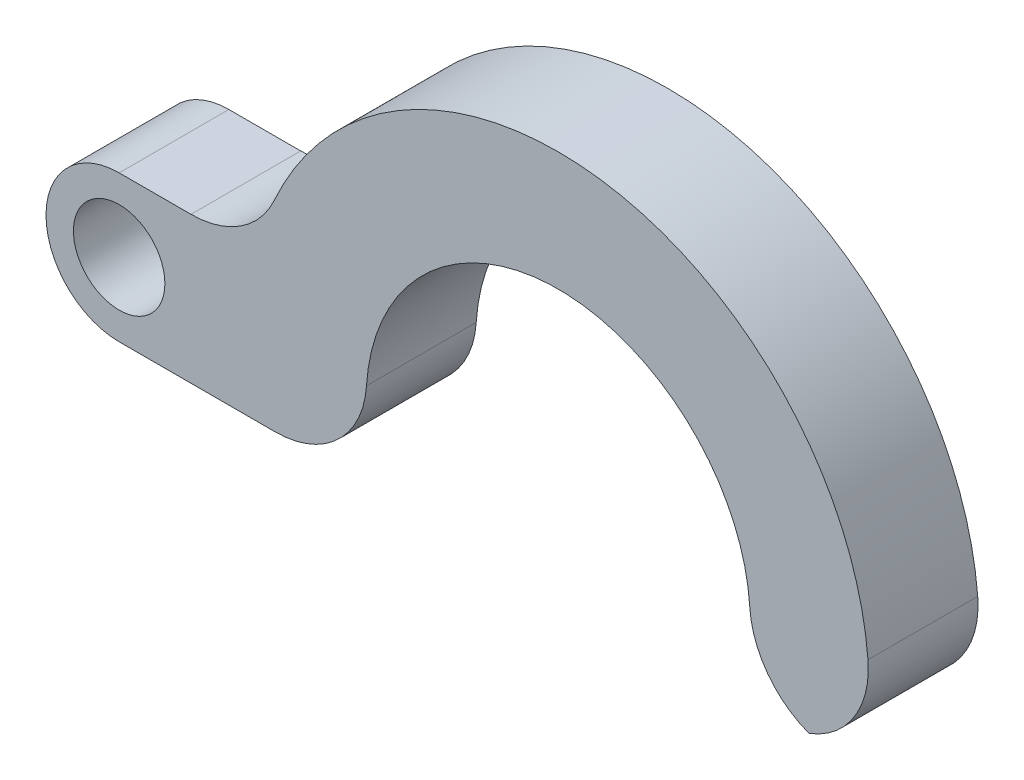
ISO-10303-21;
HEADER;
FILE_DESCRIPTION(('STEP AP214'),'2;1');
FILE_NAME('part.step','',(''),(''),'','','');
FILE_SCHEMA(('AUTOMOTIVE_DESIGN { 1 0 10303 214 1 1 1 1 }'));
ENDSEC;
DATA;
#1=APPLICATION_CONTEXT('core data for automotive mechanical design processes');
#2=APPLICATION_PROTOCOL_DEFINITION('international standard','automotive_design',2000,#1);
#3=PRODUCT_CONTEXT('',#1,'mechanical');
#4=PRODUCT('Part','Part','',(#3));
#5=PRODUCT_RELATED_PRODUCT_CATEGORY('part','',(#4));
#6=PRODUCT_DEFINITION_FORMATION('','',#4);
#7=PRODUCT_DEFINITION_CONTEXT('part definition',#1,'design');
#8=PRODUCT_DEFINITION('design','',#6,#7);
#9=PRODUCT_DEFINITION_SHAPE('','',#8);
#10=(LENGTH_UNIT() NAMED_UNIT(*) SI_UNIT(.MILLI.,.METRE.));
#11=(NAMED_UNIT(*) PLANE_ANGLE_UNIT() SI_UNIT($,.RADIAN.));
#12=(NAMED_UNIT(*) SI_UNIT($,.STERADIAN.) SOLID_ANGLE_UNIT());
#13=UNCERTAINTY_MEASURE_WITH_UNIT(LENGTH_MEASURE(1.E-05),#10,'distance_accuracy_value','');
#14=(GEOMETRIC_REPRESENTATION_CONTEXT(3) GLOBAL_UNCERTAINTY_ASSIGNED_CONTEXT((#13)) GLOBAL_UNIT_ASSIGNED_CONTEXT((#10,
#11,#12)) REPRESENTATION_CONTEXT('',''));
#15=CARTESIAN_POINT('',(0.,0.,0.));
#16=DIRECTION('',(0.,0.,1.));
#17=DIRECTION('',(1.,0.,0.));
#18=AXIS2_PLACEMENT_3D('',#15,#16,#17);
#19=CARTESIAN_POINT('',(-12.,0.,3.));
#20=DIRECTION('',(0.,0.,-1.));
#21=DIRECTION('',(-1.,0.,0.));
#22=AXIS2_PLACEMENT_3D('',#19,#20,#21);
#23=CYLINDRICAL_SURFACE('',#22,2.);
#24=CARTESIAN_POINT('',(-12.,0.,0.));
#25=DIRECTION('',(0.,0.,1.));
#26=DIRECTION('',(1.,0.,0.));
#27=AXIS2_PLACEMENT_3D('',#24,#25,#26);
#28=CIRCLE('',#27,2.);
#29=CARTESIAN_POINT('',(-12.,1.99999999999999,0.));
#30=VERTEX_POINT('',#29);
#31=CARTESIAN_POINT('',(-12.,-2.,0.));
#32=VERTEX_POINT('',#31);
#33=EDGE_CURVE('E144',#30,#32,#28,.T.);
#34=ORIENTED_EDGE('',*,*,#33,.T.);
#35=DIRECTION('',(0.,0.,-1.));
#36=VECTOR('',#35,1.);
#37=CARTESIAN_POINT('',(-12.,-2.,3.));
#38=LINE('',#37,#36);
#39=CARTESIAN_POINT('',(-12.,-2.,3.));
#40=VERTEX_POINT('',#39);
#41=EDGE_CURVE('E124',#40,#32,#38,.T.);
#42=ORIENTED_EDGE('',*,*,#41,.F.);
#43=CARTESIAN_POINT('',(-12.,0.,3.));
#44=DIRECTION('',(0.,0.,1.));
#45=DIRECTION('',(1.,0.,0.));
#46=AXIS2_PLACEMENT_3D('',#43,#44,#45);
#47=CIRCLE('',#46,2.);
#48=CARTESIAN_POINT('',(-12.,1.99999999999999,3.));
#49=VERTEX_POINT('',#48);
#50=EDGE_CURVE('E130',#49,#40,#47,.T.);
#51=ORIENTED_EDGE('',*,*,#50,.F.);
#52=DIRECTION('',(0.,0.,-1.));
#53=VECTOR('',#52,1.);
#54=CARTESIAN_POINT('',(-12.,1.99999999999999,3.));
#55=LINE('',#54,#53);
#56=EDGE_CURVE('E147',#49,#30,#55,.T.);
#57=ORIENTED_EDGE('',*,*,#56,.T.);
#58=EDGE_LOOP('',(#34,#42,#51,#57));
#59=FACE_BOUND('',#58,.T.);
#60=ADVANCED_FACE('F47',(#59),#23,.T.);
#61=CARTESIAN_POINT('',(0.,-2.00000000000001,3.));
#62=DIRECTION('',(0.,1.,0.));
#63=DIRECTION('',(0.,0.,1.));
#64=AXIS2_PLACEMENT_3D('',#61,#62,#63);
#65=PLANE('',#64);
#66=DIRECTION('',(1.,0.,0.));
#67=VECTOR('',#66,1.);
#68=CARTESIAN_POINT('',(0.,-2.00000000000001,0.));
#69=LINE('',#68,#67);
#70=CARTESIAN_POINT('',(-7.73385414912901,-2.00000000000001,0.));
#71=VERTEX_POINT('',#70);
#72=EDGE_CURVE('E225',#32,#71,#69,.T.);
#73=ORIENTED_EDGE('',*,*,#72,.T.);
#74=DIRECTION('',(0.,0.,1.));
#75=VECTOR('',#74,1.);
#76=CARTESIAN_POINT('',(-7.73385414912901,-2.00000000000001,3.));
#77=LINE('',#76,#75);
#78=CARTESIAN_POINT('',(-7.73385414912901,-2.00000000000001,3.));
#79=VERTEX_POINT('',#78);
#80=EDGE_CURVE('E127',#71,#79,#77,.T.);
#81=ORIENTED_EDGE('',*,*,#80,.T.);
#82=DIRECTION('',(1.,0.,0.));
#83=VECTOR('',#82,1.);
#84=CARTESIAN_POINT('',(0.,-2.00000000000001,3.));
#85=LINE('',#84,#83);
#86=EDGE_CURVE('E119',#40,#79,#85,.T.);
#87=ORIENTED_EDGE('',*,*,#86,.F.);
#88=ORIENTED_EDGE('',*,*,#41,.T.);
#89=EDGE_LOOP('',(#73,#81,#87,#88));
#90=FACE_BOUND('',#89,.T.);
#91=ADVANCED_FACE('F122',(#90),#65,.F.);
#92=CARTESIAN_POINT('',(0.,0.,3.));
#93=DIRECTION('',(0.,0.,-1.));
#94=DIRECTION('',(-1.,0.,0.));
#95=AXIS2_PLACEMENT_3D('',#92,#93,#94);
#96=CYLINDRICAL_SURFACE('',#95,5.25);
#97=CARTESIAN_POINT('',(0.,0.,0.));
#98=DIRECTION('',(0.,0.,1.));
#99=DIRECTION('',(1.,0.,0.));
#100=AXIS2_PLACEMENT_3D('',#97,#98,#99);
#101=CIRCLE('',#100,5.25);
#102=CARTESIAN_POINT('',(5.23906248811965,0.33870967741935,0.));
#103=VERTEX_POINT('',#102);
#104=CARTESIAN_POINT('',(-5.23906248811965,0.33870967741935,0.));
#105=VERTEX_POINT('',#104);
#106=EDGE_CURVE('E207',#103,#105,#101,.T.);
#107=ORIENTED_EDGE('',*,*,#106,.F.);
#108=DIRECTION('',(0.,0.,-1.));
#109=VECTOR('',#108,1.);
#110=CARTESIAN_POINT('',(5.23906248811965,0.33870967741935,3.));
#111=LINE('',#110,#109);
#112=CARTESIAN_POINT('',(5.23906248811965,0.33870967741935,3.));
#113=VERTEX_POINT('',#112);
#114=EDGE_CURVE('E184',#103,#113,#111,.F.);
#115=ORIENTED_EDGE('',*,*,#114,.T.);
#116=CARTESIAN_POINT('',(0.,0.,3.));
#117=DIRECTION('',(0.,0.,1.));
#118=DIRECTION('',(1.,0.,0.));
#119=AXIS2_PLACEMENT_3D('',#116,#117,#118);
#120=CIRCLE('',#119,5.25);
#121=CARTESIAN_POINT('',(-5.23906248811965,0.33870967741935,3.));
#122=VERTEX_POINT('',#121);
#123=EDGE_CURVE('E129',#113,#122,#120,.T.);
#124=ORIENTED_EDGE('',*,*,#123,.T.);
#125=DIRECTION('',(0.,0.,-1.));
#126=VECTOR('',#125,1.);
#127=CARTESIAN_POINT('',(-5.23906248811965,0.33870967741935,3.));
#128=LINE('',#127,#126);
#129=EDGE_CURVE('E180',#122,#105,#128,.T.);
#130=ORIENTED_EDGE('',*,*,#129,.T.);
#131=EDGE_LOOP('',(#107,#115,#124,#130));
#132=FACE_BOUND('',#131,.T.);
#133=ADVANCED_FACE('F252',(#132),#96,.F.);
#134=CARTESIAN_POINT('',(0.,0.,3.));
#135=DIRECTION('',(0.,0.,-1.));
#136=DIRECTION('',(-1.,0.,0.));
#137=AXIS2_PLACEMENT_3D('',#134,#135,#136);
#138=CYLINDRICAL_SURFACE('',#137,8.5);
#139=CARTESIAN_POINT('',(0.,0.,0.));
#140=DIRECTION('',(0.,0.,1.));
#141=DIRECTION('',(1.,0.,0.));
#142=AXIS2_PLACEMENT_3D('',#139,#140,#141);
#143=CIRCLE('',#142,8.5);
#144=CARTESIAN_POINT('',(8.47043469303016,0.708333333333323,0.));
#145=VERTEX_POINT('',#144);
#146=CARTESIAN_POINT('',(-7.75619587041001,3.47727272727272,0.));
#147=VERTEX_POINT('',#146);
#148=EDGE_CURVE('E196',#145,#147,#143,.T.);
#149=ORIENTED_EDGE('',*,*,#148,.T.);
#150=DIRECTION('',(0.,0.,-1.));
#151=VECTOR('',#150,1.);
#152=CARTESIAN_POINT('',(-7.75619587041001,3.47727272727272,3.));
#153=LINE('',#152,#151);
#154=CARTESIAN_POINT('',(-7.75619587041001,3.47727272727272,3.));
#155=VERTEX_POINT('',#154);
#156=EDGE_CURVE('E161',#147,#155,#153,.F.);
#157=ORIENTED_EDGE('',*,*,#156,.T.);
#158=CARTESIAN_POINT('',(0.,0.,3.));
#159=DIRECTION('',(0.,0.,1.));
#160=DIRECTION('',(1.,0.,0.));
#161=AXIS2_PLACEMENT_3D('',#158,#159,#160);
#162=CIRCLE('',#161,8.5);
#163=CARTESIAN_POINT('',(8.47043469303016,0.708333333333323,3.));
#164=VERTEX_POINT('',#163);
#165=EDGE_CURVE('E211',#164,#155,#162,.T.);
#166=ORIENTED_EDGE('',*,*,#165,.F.);
#167=DIRECTION('',(0.,0.,-1.));
#168=VECTOR('',#167,1.);
#169=CARTESIAN_POINT('',(8.47043469303016,0.708333333333323,3.));
#170=LINE('',#169,#168);
#171=EDGE_CURVE('E152',#164,#145,#170,.T.);
#172=ORIENTED_EDGE('',*,*,#171,.T.);
#173=EDGE_LOOP('',(#149,#157,#166,#172));
#174=FACE_BOUND('',#173,.T.);
#175=ADVANCED_FACE('F202',(#174),#138,.T.);
#176=CARTESIAN_POINT('',(0.,1.99999999999999,3.));
#177=DIRECTION('',(0.,-1.,0.));
#178=DIRECTION('',(0.,0.,-1.));
#179=AXIS2_PLACEMENT_3D('',#176,#177,#178);
#180=PLANE('',#179);
#181=DIRECTION('',(-1.,0.,0.));
#182=VECTOR('',#181,1.);
#183=CARTESIAN_POINT('',(0.,1.99999999999999,3.));
#184=LINE('',#183,#182);
#185=CARTESIAN_POINT('',(-10.0374299499424,1.99999999999999,3.));
#186=VERTEX_POINT('',#185);
#187=EDGE_CURVE('E136',#186,#49,#184,.T.);
#188=ORIENTED_EDGE('',*,*,#187,.F.);
#189=DIRECTION('',(0.,0.,1.));
#190=VECTOR('',#189,1.);
#191=CARTESIAN_POINT('',(-10.0374299499424,1.99999999999999,0.));
#192=LINE('',#191,#190);
#193=CARTESIAN_POINT('',(-10.0374299499424,1.99999999999999,0.));
#194=VERTEX_POINT('',#193);
#195=EDGE_CURVE('E146',#186,#194,#192,.F.);
#196=ORIENTED_EDGE('',*,*,#195,.T.);
#197=DIRECTION('',(-1.,0.,0.));
#198=VECTOR('',#197,1.);
#199=CARTESIAN_POINT('',(0.,1.99999999999999,0.));
#200=LINE('',#199,#198);
#201=EDGE_CURVE('E197',#194,#30,#200,.T.);
#202=ORIENTED_EDGE('',*,*,#201,.T.);
#203=ORIENTED_EDGE('',*,*,#56,.F.);
#204=EDGE_LOOP('',(#188,#196,#202,#203));
#205=FACE_BOUND('',#204,.T.);
#206=ADVANCED_FACE('F213',(#205),#180,.F.);
#207=CARTESIAN_POINT('',(-12.,0.,3.));
#208=DIRECTION('',(0.,0.,-1.));
#209=DIRECTION('',(-1.,0.,0.));
#210=AXIS2_PLACEMENT_3D('',#207,#208,#209);
#211=CYLINDRICAL_SURFACE('',#210,1.25);
#212=CARTESIAN_POINT('',(-12.,0.,3.));
#213=DIRECTION('',(0.,0.,1.));
#214=DIRECTION('',(1.,0.,0.));
#215=AXIS2_PLACEMENT_3D('',#212,#213,#214);
#216=CIRCLE('',#215,1.25);
#217=CARTESIAN_POINT('',(-10.75,0.,3.));
#218=VERTEX_POINT('',#217);
#219=EDGE_CURVE('E154',#218,#218,#216,.T.);
#220=ORIENTED_EDGE('',*,*,#219,.T.);
#221=EDGE_LOOP('',(#220));
#222=FACE_BOUND('',#221,.T.);
#223=CARTESIAN_POINT('',(-12.,0.,0.));
#224=DIRECTION('',(0.,0.,1.));
#225=DIRECTION('',(1.,0.,0.));
#226=AXIS2_PLACEMENT_3D('',#223,#224,#225);
#227=CIRCLE('',#226,1.25);
#228=CARTESIAN_POINT('',(-10.75,0.,0.));
#229=VERTEX_POINT('',#228);
#230=EDGE_CURVE('E141',#229,#229,#227,.T.);
#231=ORIENTED_EDGE('',*,*,#230,.F.);
#232=EDGE_LOOP('',(#231));
#233=FACE_BOUND('',#232,.T.);
#234=ADVANCED_FACE('F236',(#222,#233),#211,.F.);
#235=CARTESIAN_POINT('',(0.,0.,3.));
#236=DIRECTION('',(0.,0.,1.));
#237=DIRECTION('',(1.,0.,0.));
#238=AXIS2_PLACEMENT_3D('',#235,#236,#237);
#239=PLANE('',#238);
#240=CARTESIAN_POINT('',(7.73385414912901,0.499999999999993,3.));
#241=DIRECTION('',(0.,0.,1.));
#242=DIRECTION('',(1.,0.,0.));
#243=AXIS2_PLACEMENT_3D('',#240,#241,#242);
#244=CIRCLE('',#243,2.5);
#245=CARTESIAN_POINT('',(6.85649226033985,-1.84099041350031,3.));
#246=VERTEX_POINT('',#245);
#247=EDGE_CURVE('E64',#113,#246,#244,.T.);
#248=ORIENTED_EDGE('',*,*,#247,.T.);
#249=CARTESIAN_POINT('',(5.9791303715507,0.499999999999993,3.));
#250=DIRECTION('',(0.,0.,1.));
#251=DIRECTION('',(1.,0.,0.));
#252=AXIS2_PLACEMENT_3D('',#249,#250,#251);
#253=CIRCLE('',#252,2.5);
#254=EDGE_CURVE('E177',#246,#164,#253,.T.);
#255=ORIENTED_EDGE('',*,*,#254,.T.);
#256=ORIENTED_EDGE('',*,*,#165,.T.);
#257=CARTESIAN_POINT('',(-10.0374299499424,4.49999999999999,3.));
#258=DIRECTION('',(0.,0.,1.));
#259=DIRECTION('',(1.,0.,0.));
#260=AXIS2_PLACEMENT_3D('',#257,#258,#259);
#261=CIRCLE('',#260,2.5);
#262=EDGE_CURVE('E11',#155,#186,#261,.F.);
#263=ORIENTED_EDGE('',*,*,#262,.T.);
#264=ORIENTED_EDGE('',*,*,#187,.T.);
#265=ORIENTED_EDGE('',*,*,#50,.T.);
#266=ORIENTED_EDGE('',*,*,#86,.T.);
#267=CARTESIAN_POINT('',(-7.73385414912901,0.499999999999993,3.));
#268=DIRECTION('',(0.,0.,1.));
#269=DIRECTION('',(1.,0.,0.));
#270=AXIS2_PLACEMENT_3D('',#267,#268,#269);
#271=CIRCLE('',#270,2.5);
#272=EDGE_CURVE('E70',#79,#122,#271,.T.);
#273=ORIENTED_EDGE('',*,*,#272,.T.);
#274=ORIENTED_EDGE('',*,*,#123,.F.);
#275=EDGE_LOOP('',(#248,#255,#256,#263,#264,#265,#266,#273,#274));
#276=FACE_BOUND('',#275,.T.);
#277=ORIENTED_EDGE('',*,*,#219,.F.);
#278=EDGE_LOOP('',(#277));
#279=FACE_BOUND('',#278,.T.);
#280=ADVANCED_FACE('F133',(#276,#279),#239,.T.);
#281=CARTESIAN_POINT('',(0.,0.,0.));
#282=DIRECTION('',(0.,0.,1.));
#283=DIRECTION('',(1.,0.,0.));
#284=AXIS2_PLACEMENT_3D('',#281,#282,#283);
#285=PLANE('',#284);
#286=ORIENTED_EDGE('',*,*,#148,.F.);
#287=CARTESIAN_POINT('',(5.9791303715507,0.499999999999993,0.));
#288=DIRECTION('',(0.,0.,1.));
#289=DIRECTION('',(1.,0.,0.));
#290=AXIS2_PLACEMENT_3D('',#287,#288,#289);
#291=CIRCLE('',#290,2.5);
#292=CARTESIAN_POINT('',(6.85649226033985,-1.84099041350031,0.));
#293=VERTEX_POINT('',#292);
#294=EDGE_CURVE('E170',#145,#293,#291,.F.);
#295=ORIENTED_EDGE('',*,*,#294,.T.);
#296=CARTESIAN_POINT('',(7.73385414912901,0.499999999999993,0.));
#297=DIRECTION('',(0.,0.,1.));
#298=DIRECTION('',(1.,0.,0.));
#299=AXIS2_PLACEMENT_3D('',#296,#297,#298);
#300=CIRCLE('',#299,2.5);
#301=EDGE_CURVE('E167',#293,#103,#300,.F.);
#302=ORIENTED_EDGE('',*,*,#301,.T.);
#303=ORIENTED_EDGE('',*,*,#106,.T.);
#304=CARTESIAN_POINT('',(-7.73385414912901,0.499999999999993,0.));
#305=DIRECTION('',(0.,0.,1.));
#306=DIRECTION('',(1.,0.,0.));
#307=AXIS2_PLACEMENT_3D('',#304,#305,#306);
#308=CIRCLE('',#307,2.5);
#309=EDGE_CURVE('E164',#105,#71,#308,.F.);
#310=ORIENTED_EDGE('',*,*,#309,.T.);
#311=ORIENTED_EDGE('',*,*,#72,.F.);
#312=ORIENTED_EDGE('',*,*,#33,.F.);
#313=ORIENTED_EDGE('',*,*,#201,.F.);
#314=CARTESIAN_POINT('',(-10.0374299499424,4.49999999999999,0.));
#315=DIRECTION('',(0.,0.,1.));
#316=DIRECTION('',(1.,0.,0.));
#317=AXIS2_PLACEMENT_3D('',#314,#315,#316);
#318=CIRCLE('',#317,2.5);
#319=EDGE_CURVE('E57',#194,#147,#318,.T.);
#320=ORIENTED_EDGE('',*,*,#319,.T.);
#321=EDGE_LOOP('',(#286,#295,#302,#303,#310,#311,#312,#313,#320));
#322=FACE_BOUND('',#321,.T.);
#323=ORIENTED_EDGE('',*,*,#230,.T.);
#324=EDGE_LOOP('',(#323));
#325=FACE_BOUND('',#324,.T.);
#326=ADVANCED_FACE('F194',(#322,#325),#285,.F.);
#327=CARTESIAN_POINT('',(-10.0374299499424,4.49999999999999,3.));
#328=DIRECTION('',(0.,0.,-1.));
#329=DIRECTION('',(-1.,0.,0.));
#330=AXIS2_PLACEMENT_3D('',#327,#328,#329);
#331=CYLINDRICAL_SURFACE('',#330,2.5);
#332=ORIENTED_EDGE('',*,*,#262,.F.);
#333=ORIENTED_EDGE('',*,*,#156,.F.);
#334=ORIENTED_EDGE('',*,*,#319,.F.);
#335=ORIENTED_EDGE('',*,*,#195,.F.);
#336=EDGE_LOOP('',(#332,#333,#334,#335));
#337=FACE_BOUND('',#336,.T.);
#338=ADVANCED_FACE('F210',(#337),#331,.F.);
#339=CARTESIAN_POINT('',(7.73385414912901,0.499999999999993,3.));
#340=DIRECTION('',(0.,0.,-1.));
#341=DIRECTION('',(-1.,0.,0.));
#342=AXIS2_PLACEMENT_3D('',#339,#340,#341);
#343=CYLINDRICAL_SURFACE('',#342,2.5);
#344=DIRECTION('',(0.,0.,-1.));
#345=VECTOR('',#344,1.);
#346=CARTESIAN_POINT('',(6.85649226033985,-1.84099041350031,1.5));
#347=LINE('',#346,#345);
#348=EDGE_CURVE('E51',#246,#293,#347,.T.);
#349=ORIENTED_EDGE('',*,*,#348,.F.);
#350=ORIENTED_EDGE('',*,*,#247,.F.);
#351=ORIENTED_EDGE('',*,*,#114,.F.);
#352=ORIENTED_EDGE('',*,*,#301,.F.);
#353=EDGE_LOOP('',(#349,#350,#351,#352));
#354=FACE_BOUND('',#353,.T.);
#355=ADVANCED_FACE('F258',(#354),#343,.T.);
#356=CARTESIAN_POINT('',(5.9791303715507,0.499999999999993,3.));
#357=DIRECTION('',(0.,0.,-1.));
#358=DIRECTION('',(-1.,0.,0.));
#359=AXIS2_PLACEMENT_3D('',#356,#357,#358);
#360=CYLINDRICAL_SURFACE('',#359,2.5);
#361=ORIENTED_EDGE('',*,*,#254,.F.);
#362=ORIENTED_EDGE('',*,*,#348,.T.);
#363=ORIENTED_EDGE('',*,*,#294,.F.);
#364=ORIENTED_EDGE('',*,*,#171,.F.);
#365=EDGE_LOOP('',(#361,#362,#363,#364));
#366=FACE_BOUND('',#365,.T.);
#367=ADVANCED_FACE('F259',(#366),#360,.T.);
#368=CARTESIAN_POINT('',(-7.73385414912901,0.499999999999993,3.));
#369=DIRECTION('',(0.,0.,-1.));
#370=DIRECTION('',(-1.,0.,0.));
#371=AXIS2_PLACEMENT_3D('',#368,#369,#370);
#372=CYLINDRICAL_SURFACE('',#371,2.5);
#373=ORIENTED_EDGE('',*,*,#272,.F.);
#374=ORIENTED_EDGE('',*,*,#80,.F.);
#375=ORIENTED_EDGE('',*,*,#309,.F.);
#376=ORIENTED_EDGE('',*,*,#129,.F.);
#377=EDGE_LOOP('',(#373,#374,#375,#376));
#378=FACE_BOUND('',#377,.T.);
#379=ADVANCED_FACE('F49',(#378),#372,.T.);
#380=CLOSED_SHELL('',(#60,#91,#133,#175,#206,#234,#280,#326,#338,#355,#367,#379));
#381=MANIFOLD_SOLID_BREP('B2',#380);
#382=ADVANCED_BREP_SHAPE_REPRESENTATION('',(#18,#381),#14);
#383=SHAPE_DEFINITION_REPRESENTATION(#9,#382);
ENDSEC;
END-ISO-10303-21;
